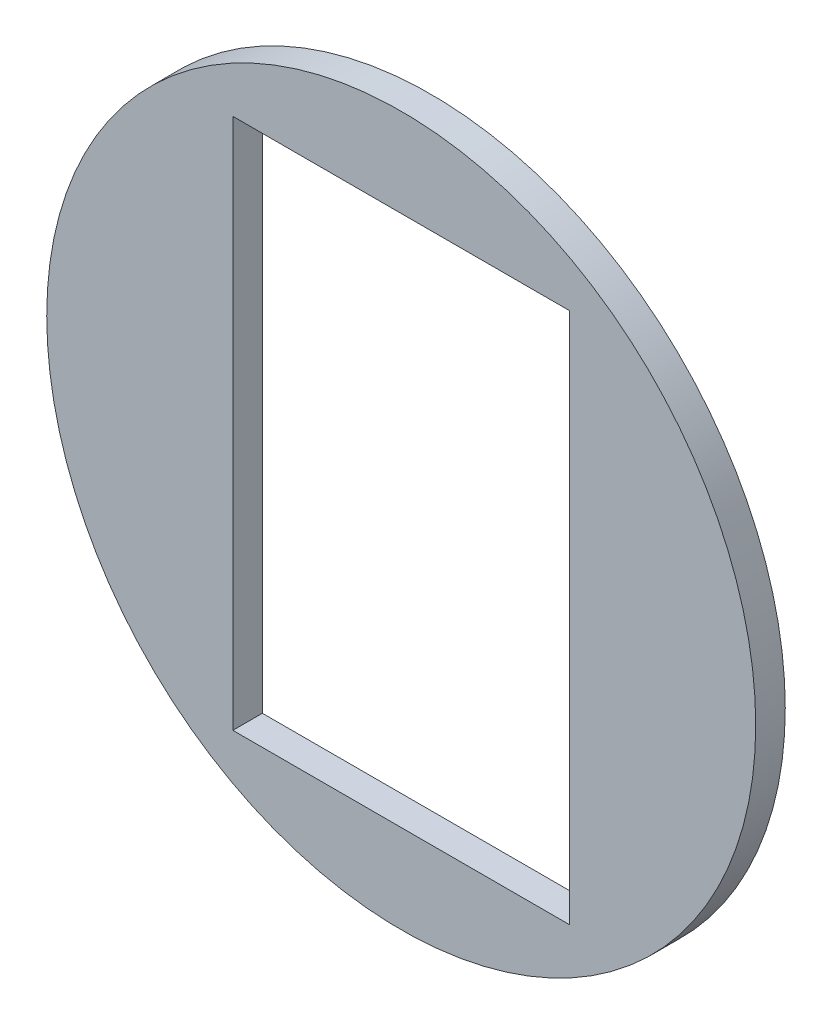
ISO-10303-21;
HEADER;
FILE_DESCRIPTION(('STEP AP214'),'2;1');
FILE_NAME('part.step','',(''),(''),'','','');
FILE_SCHEMA(('AUTOMOTIVE_DESIGN { 1 0 10303 214 1 1 1 1 }'));
ENDSEC;
DATA;
#1=APPLICATION_CONTEXT('core data for automotive mechanical design processes');
#2=APPLICATION_PROTOCOL_DEFINITION('international standard','automotive_design',2000,#1);
#3=PRODUCT_CONTEXT('',#1,'mechanical');
#4=PRODUCT('Part','Part','',(#3));
#5=PRODUCT_RELATED_PRODUCT_CATEGORY('part','',(#4));
#6=PRODUCT_DEFINITION_FORMATION('','',#4);
#7=PRODUCT_DEFINITION_CONTEXT('part definition',#1,'design');
#8=PRODUCT_DEFINITION('design','',#6,#7);
#9=PRODUCT_DEFINITION_SHAPE('','',#8);
#10=(LENGTH_UNIT() NAMED_UNIT(*) SI_UNIT(.MILLI.,.METRE.));
#11=(NAMED_UNIT(*) PLANE_ANGLE_UNIT() SI_UNIT($,.RADIAN.));
#12=(NAMED_UNIT(*) SI_UNIT($,.STERADIAN.) SOLID_ANGLE_UNIT());
#13=UNCERTAINTY_MEASURE_WITH_UNIT(LENGTH_MEASURE(1.E-05),#10,'distance_accuracy_value','');
#14=(GEOMETRIC_REPRESENTATION_CONTEXT(3) GLOBAL_UNCERTAINTY_ASSIGNED_CONTEXT((#13)) GLOBAL_UNIT_ASSIGNED_CONTEXT((#10,
#11,#12)) REPRESENTATION_CONTEXT('',''));
#15=CARTESIAN_POINT('',(0.,0.,0.));
#16=DIRECTION('',(0.,0.,1.));
#17=DIRECTION('',(1.,0.,0.));
#18=AXIS2_PLACEMENT_3D('',#15,#16,#17);
#19=CARTESIAN_POINT('',(0.,0.,6.35));
#20=DIRECTION('',(0.,0.,-1.));
#21=DIRECTION('',(-1.,0.,0.));
#22=AXIS2_PLACEMENT_3D('',#19,#20,#21);
#23=CYLINDRICAL_SURFACE('',#22,76.2);
#24=CARTESIAN_POINT('',(0.,0.,6.35));
#25=DIRECTION('',(0.,0.,1.));
#26=DIRECTION('',(1.,0.,0.));
#27=AXIS2_PLACEMENT_3D('',#24,#25,#26);
#28=CIRCLE('',#27,76.2);
#29=CARTESIAN_POINT('',(76.2,0.,6.35));
#30=VERTEX_POINT('',#29);
#31=EDGE_CURVE('E12',#30,#30,#28,.T.);
#32=ORIENTED_EDGE('',*,*,#31,.F.);
#33=EDGE_LOOP('',(#32));
#34=FACE_BOUND('',#33,.T.);
#35=CARTESIAN_POINT('',(0.,0.,0.));
#36=DIRECTION('',(0.,0.,1.));
#37=DIRECTION('',(1.,0.,0.));
#38=AXIS2_PLACEMENT_3D('',#35,#36,#37);
#39=CIRCLE('',#38,76.2);
#40=CARTESIAN_POINT('',(76.2,0.,0.));
#41=VERTEX_POINT('',#40);
#42=EDGE_CURVE('E50',#41,#41,#39,.T.);
#43=ORIENTED_EDGE('',*,*,#42,.T.);
#44=EDGE_LOOP('',(#43));
#45=FACE_BOUND('',#44,.T.);
#46=ADVANCED_FACE('F47',(#34,#45),#23,.T.);
#47=CARTESIAN_POINT('',(0.,0.,6.35));
#48=DIRECTION('',(0.,0.,1.));
#49=DIRECTION('',(1.,0.,0.));
#50=AXIS2_PLACEMENT_3D('',#47,#48,#49);
#51=PLANE('',#50);
#52=DIRECTION('',(-1.,0.,0.));
#53=VECTOR('',#52,1.);
#54=CARTESIAN_POINT('',(36.195,-57.15,6.35));
#55=LINE('',#54,#53);
#56=CARTESIAN_POINT('',(36.195,-57.15,6.35));
#57=VERTEX_POINT('',#56);
#58=CARTESIAN_POINT('',(-36.195,-57.15,6.35));
#59=VERTEX_POINT('',#58);
#60=EDGE_CURVE('E94',#57,#59,#55,.T.);
#61=ORIENTED_EDGE('',*,*,#60,.T.);
#62=DIRECTION('',(0.,-1.,0.));
#63=VECTOR('',#62,1.);
#64=CARTESIAN_POINT('',(-36.195,57.15,6.35));
#65=LINE('',#64,#63);
#66=CARTESIAN_POINT('',(-36.195,57.15,6.35));
#67=VERTEX_POINT('',#66);
#68=EDGE_CURVE('E86',#67,#59,#65,.T.);
#69=ORIENTED_EDGE('',*,*,#68,.F.);
#70=DIRECTION('',(-1.,0.,0.));
#71=VECTOR('',#70,1.);
#72=CARTESIAN_POINT('',(36.195,57.15,6.35));
#73=LINE('',#72,#71);
#74=CARTESIAN_POINT('',(36.195,57.15,6.35));
#75=VERTEX_POINT('',#74);
#76=EDGE_CURVE('E93',#75,#67,#73,.T.);
#77=ORIENTED_EDGE('',*,*,#76,.F.);
#78=DIRECTION('',(0.,-1.,0.));
#79=VECTOR('',#78,1.);
#80=CARTESIAN_POINT('',(36.195,57.15,6.35));
#81=LINE('',#80,#79);
#82=EDGE_CURVE('E99',#75,#57,#81,.T.);
#83=ORIENTED_EDGE('',*,*,#82,.T.);
#84=EDGE_LOOP('',(#61,#69,#77,#83));
#85=FACE_BOUND('',#84,.T.);
#86=ORIENTED_EDGE('',*,*,#31,.T.);
#87=EDGE_LOOP('',(#86));
#88=FACE_BOUND('',#87,.T.);
#89=ADVANCED_FACE('F101',(#85,#88),#51,.T.);
#90=CARTESIAN_POINT('',(0.,0.,0.));
#91=DIRECTION('',(0.,0.,1.));
#92=DIRECTION('',(1.,0.,0.));
#93=AXIS2_PLACEMENT_3D('',#90,#91,#92);
#94=PLANE('',#93);
#95=DIRECTION('',(0.,-1.,0.));
#96=VECTOR('',#95,1.);
#97=CARTESIAN_POINT('',(-36.195,57.15,0.));
#98=LINE('',#97,#96);
#99=CARTESIAN_POINT('',(-36.195,57.15,0.));
#100=VERTEX_POINT('',#99);
#101=CARTESIAN_POINT('',(-36.195,-57.15,0.));
#102=VERTEX_POINT('',#101);
#103=EDGE_CURVE('E113',#100,#102,#98,.T.);
#104=ORIENTED_EDGE('',*,*,#103,.T.);
#105=DIRECTION('',(-1.,0.,0.));
#106=VECTOR('',#105,1.);
#107=CARTESIAN_POINT('',(36.195,-57.15,0.));
#108=LINE('',#107,#106);
#109=CARTESIAN_POINT('',(36.195,-57.15,0.));
#110=VERTEX_POINT('',#109);
#111=EDGE_CURVE('E69',#110,#102,#108,.T.);
#112=ORIENTED_EDGE('',*,*,#111,.F.);
#113=DIRECTION('',(0.,-1.,0.));
#114=VECTOR('',#113,1.);
#115=CARTESIAN_POINT('',(36.195,57.15,0.));
#116=LINE('',#115,#114);
#117=CARTESIAN_POINT('',(36.195,57.15,0.));
#118=VERTEX_POINT('',#117);
#119=EDGE_CURVE('E104',#118,#110,#116,.T.);
#120=ORIENTED_EDGE('',*,*,#119,.F.);
#121=DIRECTION('',(-1.,0.,0.));
#122=VECTOR('',#121,1.);
#123=CARTESIAN_POINT('',(36.195,57.15,0.));
#124=LINE('',#123,#122);
#125=EDGE_CURVE('E107',#118,#100,#124,.T.);
#126=ORIENTED_EDGE('',*,*,#125,.T.);
#127=EDGE_LOOP('',(#104,#112,#120,#126));
#128=FACE_BOUND('',#127,.T.);
#129=ORIENTED_EDGE('',*,*,#42,.F.);
#130=EDGE_LOOP('',(#129));
#131=FACE_BOUND('',#130,.T.);
#132=ADVANCED_FACE('F126',(#128,#131),#94,.F.);
#133=CARTESIAN_POINT('',(36.195,-57.15,6.35));
#134=DIRECTION('',(0.,-1.,0.));
#135=DIRECTION('',(1.,0.,0.));
#136=AXIS2_PLACEMENT_3D('',#133,#134,#135);
#137=PLANE('',#136);
#138=ORIENTED_EDGE('',*,*,#111,.T.);
#139=DIRECTION('',(0.,0.,-1.));
#140=VECTOR('',#139,1.);
#141=CARTESIAN_POINT('',(-36.195,-57.15,6.35));
#142=LINE('',#141,#140);
#143=EDGE_CURVE('E88',#59,#102,#142,.T.);
#144=ORIENTED_EDGE('',*,*,#143,.F.);
#145=ORIENTED_EDGE('',*,*,#60,.F.);
#146=DIRECTION('',(0.,0.,-1.));
#147=VECTOR('',#146,1.);
#148=CARTESIAN_POINT('',(36.195,-57.15,6.35));
#149=LINE('',#148,#147);
#150=EDGE_CURVE('E117',#57,#110,#149,.T.);
#151=ORIENTED_EDGE('',*,*,#150,.T.);
#152=EDGE_LOOP('',(#138,#144,#145,#151));
#153=FACE_BOUND('',#152,.T.);
#154=ADVANCED_FACE('F97',(#153),#137,.F.);
#155=CARTESIAN_POINT('',(36.195,57.15,6.35));
#156=DIRECTION('',(1.,0.,0.));
#157=DIRECTION('',(0.,1.,0.));
#158=AXIS2_PLACEMENT_3D('',#155,#156,#157);
#159=PLANE('',#158);
#160=ORIENTED_EDGE('',*,*,#119,.T.);
#161=ORIENTED_EDGE('',*,*,#150,.F.);
#162=ORIENTED_EDGE('',*,*,#82,.F.);
#163=DIRECTION('',(0.,0.,-1.));
#164=VECTOR('',#163,1.);
#165=CARTESIAN_POINT('',(36.195,57.15,6.35));
#166=LINE('',#165,#164);
#167=EDGE_CURVE('E119',#75,#118,#166,.T.);
#168=ORIENTED_EDGE('',*,*,#167,.T.);
#169=EDGE_LOOP('',(#160,#161,#162,#168));
#170=FACE_BOUND('',#169,.T.);
#171=ADVANCED_FACE('F129',(#170),#159,.F.);
#172=CARTESIAN_POINT('',(36.195,57.15,6.35));
#173=DIRECTION('',(0.,-1.,0.));
#174=DIRECTION('',(1.,0.,0.));
#175=AXIS2_PLACEMENT_3D('',#172,#173,#174);
#176=PLANE('',#175);
#177=ORIENTED_EDGE('',*,*,#125,.F.);
#178=ORIENTED_EDGE('',*,*,#167,.F.);
#179=ORIENTED_EDGE('',*,*,#76,.T.);
#180=DIRECTION('',(0.,0.,-1.));
#181=VECTOR('',#180,1.);
#182=CARTESIAN_POINT('',(-36.195,57.15,6.35));
#183=LINE('',#182,#181);
#184=EDGE_CURVE('E61',#67,#100,#183,.T.);
#185=ORIENTED_EDGE('',*,*,#184,.T.);
#186=EDGE_LOOP('',(#177,#178,#179,#185));
#187=FACE_BOUND('',#186,.T.);
#188=ADVANCED_FACE('F123',(#187),#176,.T.);
#189=CARTESIAN_POINT('',(-36.195,57.15,6.35));
#190=DIRECTION('',(1.,0.,0.));
#191=DIRECTION('',(0.,1.,0.));
#192=AXIS2_PLACEMENT_3D('',#189,#190,#191);
#193=PLANE('',#192);
#194=ORIENTED_EDGE('',*,*,#103,.F.);
#195=ORIENTED_EDGE('',*,*,#184,.F.);
#196=ORIENTED_EDGE('',*,*,#68,.T.);
#197=ORIENTED_EDGE('',*,*,#143,.T.);
#198=EDGE_LOOP('',(#194,#195,#196,#197));
#199=FACE_BOUND('',#198,.T.);
#200=ADVANCED_FACE('F87',(#199),#193,.T.);
#201=CLOSED_SHELL('',(#46,#89,#132,#154,#171,#188,#200));
#202=MANIFOLD_SOLID_BREP('B2',#201);
#203=ADVANCED_BREP_SHAPE_REPRESENTATION('',(#18,#202),#14);
#204=SHAPE_DEFINITION_REPRESENTATION(#9,#203);
ENDSEC;
END-ISO-10303-21;
